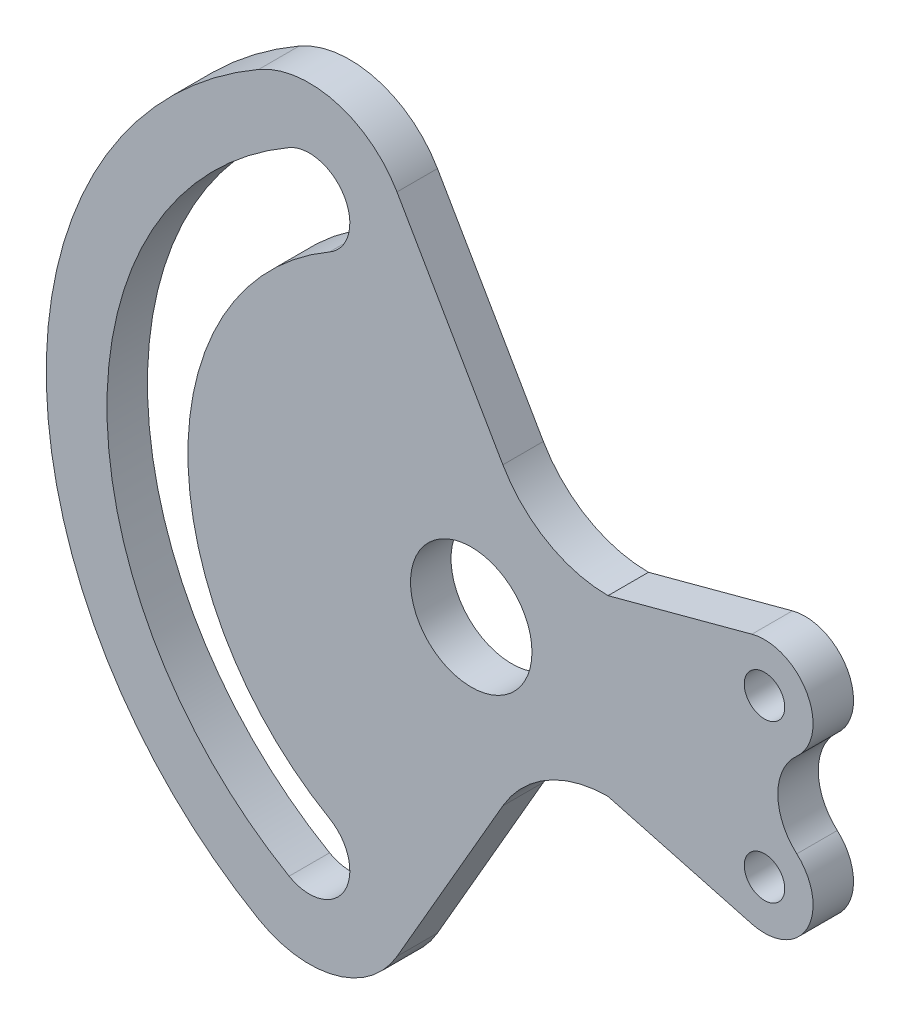
ISO-10303-21;
HEADER;
FILE_DESCRIPTION(('STEP AP214'),'2;1');
FILE_NAME('part.step','',(''),(''),'','','');
FILE_SCHEMA(('AUTOMOTIVE_DESIGN { 1 0 10303 214 1 1 1 1 }'));
ENDSEC;
DATA;
#1=APPLICATION_CONTEXT('core data for automotive mechanical design processes');
#2=APPLICATION_PROTOCOL_DEFINITION('international standard','automotive_design',2000,#1);
#3=PRODUCT_CONTEXT('',#1,'mechanical');
#4=PRODUCT('Part','Part','',(#3));
#5=PRODUCT_RELATED_PRODUCT_CATEGORY('part','',(#4));
#6=PRODUCT_DEFINITION_FORMATION('','',#4);
#7=PRODUCT_DEFINITION_CONTEXT('part definition',#1,'design');
#8=PRODUCT_DEFINITION('design','',#6,#7);
#9=PRODUCT_DEFINITION_SHAPE('','',#8);
#10=(LENGTH_UNIT() NAMED_UNIT(*) SI_UNIT(.MILLI.,.METRE.));
#11=(NAMED_UNIT(*) PLANE_ANGLE_UNIT() SI_UNIT($,.RADIAN.));
#12=(NAMED_UNIT(*) SI_UNIT($,.STERADIAN.) SOLID_ANGLE_UNIT());
#13=UNCERTAINTY_MEASURE_WITH_UNIT(LENGTH_MEASURE(1.E-05),#10,'distance_accuracy_value','');
#14=(GEOMETRIC_REPRESENTATION_CONTEXT(3) GLOBAL_UNCERTAINTY_ASSIGNED_CONTEXT((#13)) GLOBAL_UNIT_ASSIGNED_CONTEXT((#10,
#11,#12)) REPRESENTATION_CONTEXT('',''));
#15=CARTESIAN_POINT('',(0.,0.,0.));
#16=DIRECTION('',(0.,0.,1.));
#17=DIRECTION('',(1.,0.,0.));
#18=AXIS2_PLACEMENT_3D('',#15,#16,#17);
#19=CARTESIAN_POINT('',(-39.9999999999999,-69.2820323027552,10.));
#20=DIRECTION('',(0.,0.,-1.));
#21=DIRECTION('',(-1.,0.,0.));
#22=AXIS2_PLACEMENT_3D('',#19,#20,#21);
#23=PLANE('',#22);
#24=CARTESIAN_POINT('',(72.4444369716801,19.4114283826891,10.));
#25=DIRECTION('',(0.,0.,1.));
#26=DIRECTION('',(1.,0.,0.));
#27=AXIS2_PLACEMENT_3D('',#24,#25,#26);
#28=CIRCLE('',#27,4.99999999999999);
#29=CARTESIAN_POINT('',(77.4444369716801,19.4114283826891,10.));
#30=VERTEX_POINT('',#29);
#31=EDGE_CURVE('E204',#30,#30,#28,.T.);
#32=ORIENTED_EDGE('',*,*,#31,.F.);
#33=EDGE_LOOP('',(#32));
#34=FACE_BOUND('',#33,.T.);
#35=CARTESIAN_POINT('',(-39.9999999999999,-69.2820323027552,10.));
#36=DIRECTION('',(0.,0.,1.));
#37=DIRECTION('',(-1.,0.,0.));
#38=AXIS2_PLACEMENT_3D('',#35,#36,#37);
#39=CIRCLE('',#38,25.);
#40=CARTESIAN_POINT('',(-52.4999999999998,-90.9326673973662,10.));
#41=VERTEX_POINT('',#40);
#42=CARTESIAN_POINT('',(-18.3493649053889,-81.7820323027551,10.));
#43=VERTEX_POINT('',#42);
#44=EDGE_CURVE('E212',#41,#43,#39,.T.);
#45=ORIENTED_EDGE('',*,*,#44,.T.);
#46=DIRECTION('',(0.499999999999999,0.866025403784439,0.));
#47=VECTOR('',#46,1.);
#48=CARTESIAN_POINT('',(7.80758080400635,-36.4768733632617,10.));
#49=LINE('',#48,#47);
#50=CARTESIAN_POINT('',(7.80758080400635,-36.4768733632617,10.));
#51=VERTEX_POINT('',#50);
#52=EDGE_CURVE('E216',#43,#51,#49,.T.);
#53=ORIENTED_EDGE('',*,*,#52,.T.);
#54=CARTESIAN_POINT('',(33.7883429175395,-51.4768733632616,10.));
#55=DIRECTION('',(0.,0.,-1.));
#56=DIRECTION('',(1.,0.,0.));
#57=AXIS2_PLACEMENT_3D('',#54,#55,#56);
#58=CIRCLE('',#57,30.);
#59=CARTESIAN_POINT('',(33.7883429175395,-21.4768733632617,10.));
#60=VERTEX_POINT('',#59);
#61=EDGE_CURVE('E220',#51,#60,#58,.T.);
#62=ORIENTED_EDGE('',*,*,#61,.T.);
#63=DIRECTION('',(0.965925826289068,-0.25881904510252,0.));
#64=VECTOR('',#63,1.);
#65=CARTESIAN_POINT('',(69.3386084304499,-31.0025382981579,10.));
#66=LINE('',#65,#64);
#67=CARTESIAN_POINT('',(69.3386084304499,-31.0025382981579,10.));
#68=VERTEX_POINT('',#67);
#69=EDGE_CURVE('E223',#60,#68,#66,.T.);
#70=ORIENTED_EDGE('',*,*,#69,.T.);
#71=CARTESIAN_POINT('',(72.4444369716801,-19.4114283826891,10.));
#72=DIRECTION('',(0.,0.,1.));
#73=DIRECTION('',(-1.,0.,0.));
#74=AXIS2_PLACEMENT_3D('',#71,#72,#73);
#75=CIRCLE('',#74,12.);
#76=CARTESIAN_POINT('',(80.4278043460509,-10.4523075906788,10.));
#77=VERTEX_POINT('',#76);
#78=EDGE_CURVE('E226',#68,#77,#75,.T.);
#79=ORIENTED_EDGE('',*,*,#78,.T.);
#80=CARTESIAN_POINT('',(89.7417329494834,0.,10.));
#81=DIRECTION('',(0.,0.,-1.));
#82=DIRECTION('',(1.,0.,0.));
#83=AXIS2_PLACEMENT_3D('',#80,#81,#82);
#84=CIRCLE('',#83,14.);
#85=CARTESIAN_POINT('',(80.4278043460509,10.4523075906788,10.));
#86=VERTEX_POINT('',#85);
#87=EDGE_CURVE('E229',#77,#86,#84,.T.);
#88=ORIENTED_EDGE('',*,*,#87,.T.);
#89=CARTESIAN_POINT('',(72.4444369716801,19.4114283826891,10.));
#90=DIRECTION('',(0.,0.,1.));
#91=DIRECTION('',(1.,0.,0.));
#92=AXIS2_PLACEMENT_3D('',#89,#90,#91);
#93=CIRCLE('',#92,12.);
#94=CARTESIAN_POINT('',(69.3386084304499,31.0025382981579,10.));
#95=VERTEX_POINT('',#94);
#96=EDGE_CURVE('E232',#86,#95,#93,.T.);
#97=ORIENTED_EDGE('',*,*,#96,.T.);
#98=DIRECTION('',(-0.965925826289068,-0.25881904510252,0.));
#99=VECTOR('',#98,1.);
#100=CARTESIAN_POINT('',(69.3386084304499,31.0025382981579,10.));
#101=LINE('',#100,#99);
#102=CARTESIAN_POINT('',(33.7883429175395,21.4768733632616,10.));
#103=VERTEX_POINT('',#102);
#104=EDGE_CURVE('E235',#95,#103,#101,.T.);
#105=ORIENTED_EDGE('',*,*,#104,.T.);
#106=CARTESIAN_POINT('',(33.7883429175395,51.4768733632616,10.));
#107=DIRECTION('',(0.,0.,-1.));
#108=DIRECTION('',(-1.,0.,0.));
#109=AXIS2_PLACEMENT_3D('',#106,#107,#108);
#110=CIRCLE('',#109,30.);
#111=CARTESIAN_POINT('',(7.80758080400634,36.4768733632617,10.));
#112=VERTEX_POINT('',#111);
#113=EDGE_CURVE('E238',#103,#112,#110,.T.);
#114=ORIENTED_EDGE('',*,*,#113,.T.);
#115=DIRECTION('',(-0.499999999999999,0.866025403784439,0.));
#116=VECTOR('',#115,1.);
#117=CARTESIAN_POINT('',(7.80758080400635,36.4768733632617,10.));
#118=LINE('',#117,#116);
#119=CARTESIAN_POINT('',(-18.3493649053889,81.7820323027551,10.));
#120=VERTEX_POINT('',#119);
#121=EDGE_CURVE('E241',#112,#120,#118,.T.);
#122=ORIENTED_EDGE('',*,*,#121,.T.);
#123=CARTESIAN_POINT('',(-39.9999999999999,69.2820323027552,10.));
#124=DIRECTION('',(0.,0.,1.));
#125=DIRECTION('',(1.,0.,0.));
#126=AXIS2_PLACEMENT_3D('',#123,#124,#125);
#127=CIRCLE('',#126,25.);
#128=CARTESIAN_POINT('',(-52.4999999999998,90.9326673973662,10.));
#129=VERTEX_POINT('',#128);
#130=EDGE_CURVE('E244',#120,#129,#127,.T.);
#131=ORIENTED_EDGE('',*,*,#130,.T.);
#132=CARTESIAN_POINT('',(0.,0.,10.));
#133=DIRECTION('',(0.,0.,1.));
#134=DIRECTION('',(1.,0.,0.));
#135=AXIS2_PLACEMENT_3D('',#132,#133,#134);
#136=CIRCLE('',#135,105.);
#137=EDGE_CURVE('E247',#129,#41,#136,.T.);
#138=ORIENTED_EDGE('',*,*,#137,.T.);
#139=EDGE_LOOP('',(#45,#53,#62,#70,#79,#88,#97,#105,#114,#122,#131,#138));
#140=FACE_BOUND('',#139,.T.);
#141=CARTESIAN_POINT('',(-39.9999999999999,69.2820323027552,10.));
#142=DIRECTION('',(0.,0.,1.));
#143=DIRECTION('',(1.,0.,0.));
#144=AXIS2_PLACEMENT_3D('',#141,#142,#143);
#145=CIRCLE('',#144,10.);
#146=CARTESIAN_POINT('',(-35.,60.6217782649107,10.));
#147=VERTEX_POINT('',#146);
#148=CARTESIAN_POINT('',(-45.,77.9422863405995,10.));
#149=VERTEX_POINT('',#148);
#150=EDGE_CURVE('E153',#147,#149,#145,.T.);
#151=ORIENTED_EDGE('',*,*,#150,.F.);
#152=CARTESIAN_POINT('',(0.,0.,10.));
#153=DIRECTION('',(0.,0.,-1.));
#154=DIRECTION('',(1.,0.,0.));
#155=AXIS2_PLACEMENT_3D('',#152,#153,#154);
#156=CIRCLE('',#155,70.);
#157=CARTESIAN_POINT('',(-35.,-60.6217782649107,10.));
#158=VERTEX_POINT('',#157);
#159=EDGE_CURVE('E180',#158,#147,#156,.T.);
#160=ORIENTED_EDGE('',*,*,#159,.F.);
#161=CARTESIAN_POINT('',(-40.,-69.2820323027551,10.));
#162=DIRECTION('',(0.,0.,1.));
#163=DIRECTION('',(1.,0.,0.));
#164=AXIS2_PLACEMENT_3D('',#161,#162,#163);
#165=CIRCLE('',#164,10.);
#166=CARTESIAN_POINT('',(-45.,-77.9422863405995,10.));
#167=VERTEX_POINT('',#166);
#168=EDGE_CURVE('E176',#167,#158,#165,.T.);
#169=ORIENTED_EDGE('',*,*,#168,.F.);
#170=CARTESIAN_POINT('',(0.,0.,10.));
#171=DIRECTION('',(0.,0.,1.));
#172=DIRECTION('',(1.,0.,0.));
#173=AXIS2_PLACEMENT_3D('',#170,#171,#172);
#174=CIRCLE('',#173,90.);
#175=EDGE_CURVE('E162',#149,#167,#174,.T.);
#176=ORIENTED_EDGE('',*,*,#175,.F.);
#177=EDGE_LOOP('',(#151,#160,#169,#176));
#178=FACE_BOUND('',#177,.T.);
#179=CARTESIAN_POINT('',(0.,0.,10.));
#180=DIRECTION('',(0.,0.,1.));
#181=DIRECTION('',(1.,0.,0.));
#182=AXIS2_PLACEMENT_3D('',#179,#180,#181);
#183=CIRCLE('',#182,15.);
#184=CARTESIAN_POINT('',(15.,0.,10.));
#185=VERTEX_POINT('',#184);
#186=EDGE_CURVE('E188',#185,#185,#183,.T.);
#187=ORIENTED_EDGE('',*,*,#186,.F.);
#188=EDGE_LOOP('',(#187));
#189=FACE_BOUND('',#188,.T.);
#190=CARTESIAN_POINT('',(72.4444369716801,-19.4114283826891,10.));
#191=DIRECTION('',(0.,0.,1.));
#192=DIRECTION('',(-1.,0.,0.));
#193=AXIS2_PLACEMENT_3D('',#190,#191,#192);
#194=CIRCLE('',#193,4.99999999999999);
#195=CARTESIAN_POINT('',(67.4444369716801,-19.4114283826891,10.));
#196=VERTEX_POINT('',#195);
#197=EDGE_CURVE('E568',#196,#196,#194,.T.);
#198=ORIENTED_EDGE('',*,*,#197,.F.);
#199=EDGE_LOOP('',(#198));
#200=FACE_BOUND('',#199,.T.);
#201=ADVANCED_FACE('F39',(#34,#140,#178,#189,#200),#23,.F.);
#202=CARTESIAN_POINT('',(-39.9999999999999,-69.2820323027552,0.));
#203=DIRECTION('',(0.,0.,-1.));
#204=DIRECTION('',(-1.,0.,0.));
#205=AXIS2_PLACEMENT_3D('',#202,#203,#204);
#206=PLANE('',#205);
#207=CARTESIAN_POINT('',(0.,0.,0.));
#208=DIRECTION('',(0.,0.,1.));
#209=DIRECTION('',(1.,0.,0.));
#210=AXIS2_PLACEMENT_3D('',#207,#208,#209);
#211=CIRCLE('',#210,15.);
#212=CARTESIAN_POINT('',(15.,0.,0.));
#213=VERTEX_POINT('',#212);
#214=EDGE_CURVE('E576',#213,#213,#211,.T.);
#215=ORIENTED_EDGE('',*,*,#214,.T.);
#216=EDGE_LOOP('',(#215));
#217=FACE_BOUND('',#216,.T.);
#218=CARTESIAN_POINT('',(-39.9999999999999,-69.2820323027552,0.));
#219=DIRECTION('',(0.,0.,1.));
#220=DIRECTION('',(-1.,0.,0.));
#221=AXIS2_PLACEMENT_3D('',#218,#219,#220);
#222=CIRCLE('',#221,25.);
#223=CARTESIAN_POINT('',(-52.4999999999998,-90.9326673973662,0.));
#224=VERTEX_POINT('',#223);
#225=CARTESIAN_POINT('',(-18.3493649053889,-81.7820323027551,0.));
#226=VERTEX_POINT('',#225);
#227=EDGE_CURVE('E208',#224,#226,#222,.T.);
#228=ORIENTED_EDGE('',*,*,#227,.F.);
#229=CARTESIAN_POINT('',(0.,0.,0.));
#230=DIRECTION('',(0.,0.,1.));
#231=DIRECTION('',(1.,0.,0.));
#232=AXIS2_PLACEMENT_3D('',#229,#230,#231);
#233=CIRCLE('',#232,105.);
#234=CARTESIAN_POINT('',(-52.4999999999998,90.9326673973662,0.));
#235=VERTEX_POINT('',#234);
#236=EDGE_CURVE('E217',#235,#224,#233,.T.);
#237=ORIENTED_EDGE('',*,*,#236,.F.);
#238=CARTESIAN_POINT('',(-39.9999999999999,69.2820323027552,0.));
#239=DIRECTION('',(0.,0.,1.));
#240=DIRECTION('',(1.,0.,0.));
#241=AXIS2_PLACEMENT_3D('',#238,#239,#240);
#242=CIRCLE('',#241,25.);
#243=CARTESIAN_POINT('',(-18.3493649053889,81.7820323027551,0.));
#244=VERTEX_POINT('',#243);
#245=EDGE_CURVE('E281',#244,#235,#242,.T.);
#246=ORIENTED_EDGE('',*,*,#245,.F.);
#247=DIRECTION('',(-0.499999999999999,0.866025403784439,0.));
#248=VECTOR('',#247,1.);
#249=CARTESIAN_POINT('',(7.80758080400635,36.4768733632617,0.));
#250=LINE('',#249,#248);
#251=CARTESIAN_POINT('',(7.80758080400634,36.4768733632617,0.));
#252=VERTEX_POINT('',#251);
#253=EDGE_CURVE('E278',#252,#244,#250,.T.);
#254=ORIENTED_EDGE('',*,*,#253,.F.);
#255=CARTESIAN_POINT('',(33.7883429175395,51.4768733632616,0.));
#256=DIRECTION('',(0.,0.,-1.));
#257=DIRECTION('',(-1.,0.,0.));
#258=AXIS2_PLACEMENT_3D('',#255,#256,#257);
#259=CIRCLE('',#258,30.);
#260=CARTESIAN_POINT('',(33.7883429175395,21.4768733632616,0.));
#261=VERTEX_POINT('',#260);
#262=EDGE_CURVE('E275',#261,#252,#259,.T.);
#263=ORIENTED_EDGE('',*,*,#262,.F.);
#264=DIRECTION('',(-0.965925826289068,-0.25881904510252,0.));
#265=VECTOR('',#264,1.);
#266=CARTESIAN_POINT('',(69.3386084304499,31.0025382981579,0.));
#267=LINE('',#266,#265);
#268=CARTESIAN_POINT('',(69.3386084304499,31.0025382981579,0.));
#269=VERTEX_POINT('',#268);
#270=EDGE_CURVE('E272',#269,#261,#267,.T.);
#271=ORIENTED_EDGE('',*,*,#270,.F.);
#272=CARTESIAN_POINT('',(72.4444369716801,19.4114283826891,0.));
#273=DIRECTION('',(0.,0.,1.));
#274=DIRECTION('',(1.,0.,0.));
#275=AXIS2_PLACEMENT_3D('',#272,#273,#274);
#276=CIRCLE('',#275,12.);
#277=CARTESIAN_POINT('',(80.4278043460509,10.4523075906788,0.));
#278=VERTEX_POINT('',#277);
#279=EDGE_CURVE('E269',#278,#269,#276,.T.);
#280=ORIENTED_EDGE('',*,*,#279,.F.);
#281=CARTESIAN_POINT('',(89.7417329494834,0.,0.));
#282=DIRECTION('',(0.,0.,-1.));
#283=DIRECTION('',(1.,0.,0.));
#284=AXIS2_PLACEMENT_3D('',#281,#282,#283);
#285=CIRCLE('',#284,14.);
#286=CARTESIAN_POINT('',(80.4278043460509,-10.4523075906788,0.));
#287=VERTEX_POINT('',#286);
#288=EDGE_CURVE('E266',#287,#278,#285,.T.);
#289=ORIENTED_EDGE('',*,*,#288,.F.);
#290=CARTESIAN_POINT('',(72.4444369716801,-19.4114283826891,0.));
#291=DIRECTION('',(0.,0.,1.));
#292=DIRECTION('',(-1.,0.,0.));
#293=AXIS2_PLACEMENT_3D('',#290,#291,#292);
#294=CIRCLE('',#293,12.);
#295=CARTESIAN_POINT('',(69.3386084304499,-31.0025382981579,0.));
#296=VERTEX_POINT('',#295);
#297=EDGE_CURVE('E263',#296,#287,#294,.T.);
#298=ORIENTED_EDGE('',*,*,#297,.F.);
#299=DIRECTION('',(0.965925826289068,-0.25881904510252,0.));
#300=VECTOR('',#299,1.);
#301=CARTESIAN_POINT('',(69.3386084304499,-31.0025382981579,0.));
#302=LINE('',#301,#300);
#303=CARTESIAN_POINT('',(33.7883429175395,-21.4768733632617,0.));
#304=VERTEX_POINT('',#303);
#305=EDGE_CURVE('E260',#304,#296,#302,.T.);
#306=ORIENTED_EDGE('',*,*,#305,.F.);
#307=CARTESIAN_POINT('',(33.7883429175395,-51.4768733632616,0.));
#308=DIRECTION('',(0.,0.,-1.));
#309=DIRECTION('',(1.,0.,0.));
#310=AXIS2_PLACEMENT_3D('',#307,#308,#309);
#311=CIRCLE('',#310,30.);
#312=CARTESIAN_POINT('',(7.80758080400635,-36.4768733632617,0.));
#313=VERTEX_POINT('',#312);
#314=EDGE_CURVE('E257',#313,#304,#311,.T.);
#315=ORIENTED_EDGE('',*,*,#314,.F.);
#316=DIRECTION('',(0.499999999999999,0.866025403784439,0.));
#317=VECTOR('',#316,1.);
#318=CARTESIAN_POINT('',(7.80758080400635,-36.4768733632617,0.));
#319=LINE('',#318,#317);
#320=EDGE_CURVE('E254',#226,#313,#319,.T.);
#321=ORIENTED_EDGE('',*,*,#320,.F.);
#322=EDGE_LOOP('',(#228,#237,#246,#254,#263,#271,#280,#289,#298,#306,#315,#321));
#323=FACE_BOUND('',#322,.T.);
#324=CARTESIAN_POINT('',(72.4444369716801,19.4114283826891,0.));
#325=DIRECTION('',(0.,0.,1.));
#326=DIRECTION('',(1.,0.,0.));
#327=AXIS2_PLACEMENT_3D('',#324,#325,#326);
#328=CIRCLE('',#327,4.99999999999999);
#329=CARTESIAN_POINT('',(77.4444369716801,19.4114283826891,0.));
#330=VERTEX_POINT('',#329);
#331=EDGE_CURVE('E171',#330,#330,#328,.T.);
#332=ORIENTED_EDGE('',*,*,#331,.T.);
#333=EDGE_LOOP('',(#332));
#334=FACE_BOUND('',#333,.T.);
#335=CARTESIAN_POINT('',(0.,0.,0.));
#336=DIRECTION('',(0.,0.,-1.));
#337=DIRECTION('',(1.,0.,0.));
#338=AXIS2_PLACEMENT_3D('',#335,#336,#337);
#339=CIRCLE('',#338,70.);
#340=CARTESIAN_POINT('',(-35.,-60.6217782649107,0.));
#341=VERTEX_POINT('',#340);
#342=CARTESIAN_POINT('',(-35.,60.6217782649107,0.));
#343=VERTEX_POINT('',#342);
#344=EDGE_CURVE('E163',#341,#343,#339,.T.);
#345=ORIENTED_EDGE('',*,*,#344,.T.);
#346=CARTESIAN_POINT('',(-39.9999999999999,69.2820323027552,0.));
#347=DIRECTION('',(0.,0.,1.));
#348=DIRECTION('',(1.,0.,0.));
#349=AXIS2_PLACEMENT_3D('',#346,#347,#348);
#350=CIRCLE('',#349,10.);
#351=CARTESIAN_POINT('',(-45.,77.9422863405995,0.));
#352=VERTEX_POINT('',#351);
#353=EDGE_CURVE('E63',#343,#352,#350,.T.);
#354=ORIENTED_EDGE('',*,*,#353,.T.);
#355=CARTESIAN_POINT('',(0.,0.,0.));
#356=DIRECTION('',(0.,0.,1.));
#357=DIRECTION('',(1.,0.,0.));
#358=AXIS2_PLACEMENT_3D('',#355,#356,#357);
#359=CIRCLE('',#358,90.);
#360=CARTESIAN_POINT('',(-45.,-77.9422863405995,0.));
#361=VERTEX_POINT('',#360);
#362=EDGE_CURVE('E169',#352,#361,#359,.T.);
#363=ORIENTED_EDGE('',*,*,#362,.T.);
#364=CARTESIAN_POINT('',(-40.,-69.2820323027551,0.));
#365=DIRECTION('',(0.,0.,1.));
#366=DIRECTION('',(1.,0.,0.));
#367=AXIS2_PLACEMENT_3D('',#364,#365,#366);
#368=CIRCLE('',#367,10.);
#369=EDGE_CURVE('E191',#361,#341,#368,.T.);
#370=ORIENTED_EDGE('',*,*,#369,.T.);
#371=EDGE_LOOP('',(#345,#354,#363,#370));
#372=FACE_BOUND('',#371,.T.);
#373=CARTESIAN_POINT('',(72.4444369716801,-19.4114283826891,0.));
#374=DIRECTION('',(0.,0.,1.));
#375=DIRECTION('',(-1.,0.,0.));
#376=AXIS2_PLACEMENT_3D('',#373,#374,#375);
#377=CIRCLE('',#376,4.99999999999999);
#378=CARTESIAN_POINT('',(67.4444369716801,-19.4114283826891,0.));
#379=VERTEX_POINT('',#378);
#380=EDGE_CURVE('E571',#379,#379,#377,.T.);
#381=ORIENTED_EDGE('',*,*,#380,.T.);
#382=EDGE_LOOP('',(#381));
#383=FACE_BOUND('',#382,.T.);
#384=ADVANCED_FACE('F336',(#217,#323,#334,#372,#383),#206,.T.);
#385=CARTESIAN_POINT('',(-39.9999999999999,-69.2820323027552,10.));
#386=DIRECTION('',(0.,0.,-1.));
#387=DIRECTION('',(-1.,0.,0.));
#388=AXIS2_PLACEMENT_3D('',#385,#386,#387);
#389=CYLINDRICAL_SURFACE('',#388,25.);
#390=ORIENTED_EDGE('',*,*,#227,.T.);
#391=DIRECTION('',(0.,0.,-1.));
#392=VECTOR('',#391,1.);
#393=CARTESIAN_POINT('',(-18.3493649053889,-81.7820323027551,10.));
#394=LINE('',#393,#392);
#395=EDGE_CURVE('E11',#43,#226,#394,.T.);
#396=ORIENTED_EDGE('',*,*,#395,.F.);
#397=ORIENTED_EDGE('',*,*,#44,.F.);
#398=DIRECTION('',(0.,0.,-1.));
#399=VECTOR('',#398,1.);
#400=CARTESIAN_POINT('',(-52.4999999999998,-90.9326673973662,10.));
#401=LINE('',#400,#399);
#402=EDGE_CURVE('E250',#41,#224,#401,.T.);
#403=ORIENTED_EDGE('',*,*,#402,.T.);
#404=EDGE_LOOP('',(#390,#396,#397,#403));
#405=FACE_BOUND('',#404,.T.);
#406=ADVANCED_FACE('F41',(#405),#389,.T.);
#407=CARTESIAN_POINT('',(7.80758080400635,-36.4768733632617,10.));
#408=DIRECTION('',(-0.866025403784439,0.499999999999999,0.));
#409=DIRECTION('',(-0.499999999999999,-0.866025403784439,0.));
#410=AXIS2_PLACEMENT_3D('',#407,#408,#409);
#411=PLANE('',#410);
#412=ORIENTED_EDGE('',*,*,#320,.T.);
#413=DIRECTION('',(0.,0.,-1.));
#414=VECTOR('',#413,1.);
#415=CARTESIAN_POINT('',(7.80758080400635,-36.4768733632617,10.));
#416=LINE('',#415,#414);
#417=EDGE_CURVE('E48',#51,#313,#416,.T.);
#418=ORIENTED_EDGE('',*,*,#417,.F.);
#419=ORIENTED_EDGE('',*,*,#52,.F.);
#420=ORIENTED_EDGE('',*,*,#395,.T.);
#421=EDGE_LOOP('',(#412,#418,#419,#420));
#422=FACE_BOUND('',#421,.T.);
#423=ADVANCED_FACE('F353',(#422),#411,.F.);
#424=CARTESIAN_POINT('',(33.7883429175395,-51.4768733632616,10.));
#425=DIRECTION('',(0.,0.,-1.));
#426=DIRECTION('',(-1.,0.,0.));
#427=AXIS2_PLACEMENT_3D('',#424,#425,#426);
#428=CYLINDRICAL_SURFACE('',#427,30.);
#429=ORIENTED_EDGE('',*,*,#314,.T.);
#430=DIRECTION('',(0.,0.,-1.));
#431=VECTOR('',#430,1.);
#432=CARTESIAN_POINT('',(33.7883429175395,-21.4768733632617,10.));
#433=LINE('',#432,#431);
#434=EDGE_CURVE('E321',#60,#304,#433,.T.);
#435=ORIENTED_EDGE('',*,*,#434,.F.);
#436=ORIENTED_EDGE('',*,*,#61,.F.);
#437=ORIENTED_EDGE('',*,*,#417,.T.);
#438=EDGE_LOOP('',(#429,#435,#436,#437));
#439=FACE_BOUND('',#438,.T.);
#440=ADVANCED_FACE('F330',(#439),#428,.F.);
#441=CARTESIAN_POINT('',(69.3386084304499,-31.0025382981579,10.));
#442=DIRECTION('',(0.25881904510252,0.965925826289068,0.));
#443=DIRECTION('',(-0.965925826289068,0.25881904510252,0.));
#444=AXIS2_PLACEMENT_3D('',#441,#442,#443);
#445=PLANE('',#444);
#446=ORIENTED_EDGE('',*,*,#305,.T.);
#447=DIRECTION('',(0.,0.,-1.));
#448=VECTOR('',#447,1.);
#449=CARTESIAN_POINT('',(69.3386084304499,-31.0025382981579,10.));
#450=LINE('',#449,#448);
#451=EDGE_CURVE('E317',#68,#296,#450,.T.);
#452=ORIENTED_EDGE('',*,*,#451,.F.);
#453=ORIENTED_EDGE('',*,*,#69,.F.);
#454=ORIENTED_EDGE('',*,*,#434,.T.);
#455=EDGE_LOOP('',(#446,#452,#453,#454));
#456=FACE_BOUND('',#455,.T.);
#457=ADVANCED_FACE('F342',(#456),#445,.F.);
#458=CARTESIAN_POINT('',(72.4444369716801,-19.4114283826891,10.));
#459=DIRECTION('',(0.,0.,-1.));
#460=DIRECTION('',(-1.,0.,0.));
#461=AXIS2_PLACEMENT_3D('',#458,#459,#460);
#462=CYLINDRICAL_SURFACE('',#461,12.);
#463=ORIENTED_EDGE('',*,*,#297,.T.);
#464=DIRECTION('',(0.,0.,-1.));
#465=VECTOR('',#464,1.);
#466=CARTESIAN_POINT('',(80.4278043460509,-10.4523075906788,10.));
#467=LINE('',#466,#465);
#468=EDGE_CURVE('E313',#77,#287,#467,.T.);
#469=ORIENTED_EDGE('',*,*,#468,.F.);
#470=ORIENTED_EDGE('',*,*,#78,.F.);
#471=ORIENTED_EDGE('',*,*,#451,.T.);
#472=EDGE_LOOP('',(#463,#469,#470,#471));
#473=FACE_BOUND('',#472,.T.);
#474=ADVANCED_FACE('F346',(#473),#462,.T.);
#475=CARTESIAN_POINT('',(89.7417329494834,0.,10.));
#476=DIRECTION('',(0.,0.,-1.));
#477=DIRECTION('',(-1.,0.,0.));
#478=AXIS2_PLACEMENT_3D('',#475,#476,#477);
#479=CYLINDRICAL_SURFACE('',#478,14.);
#480=ORIENTED_EDGE('',*,*,#288,.T.);
#481=DIRECTION('',(0.,0.,-1.));
#482=VECTOR('',#481,1.);
#483=CARTESIAN_POINT('',(80.4278043460509,10.4523075906788,10.));
#484=LINE('',#483,#482);
#485=EDGE_CURVE('E309',#86,#278,#484,.T.);
#486=ORIENTED_EDGE('',*,*,#485,.F.);
#487=ORIENTED_EDGE('',*,*,#87,.F.);
#488=ORIENTED_EDGE('',*,*,#468,.T.);
#489=EDGE_LOOP('',(#480,#486,#487,#488));
#490=FACE_BOUND('',#489,.T.);
#491=ADVANCED_FACE('F386',(#490),#479,.F.);
#492=CARTESIAN_POINT('',(72.4444369716801,19.4114283826891,10.));
#493=DIRECTION('',(0.,0.,-1.));
#494=DIRECTION('',(-1.,0.,0.));
#495=AXIS2_PLACEMENT_3D('',#492,#493,#494);
#496=CYLINDRICAL_SURFACE('',#495,12.);
#497=ORIENTED_EDGE('',*,*,#279,.T.);
#498=DIRECTION('',(0.,0.,-1.));
#499=VECTOR('',#498,1.);
#500=CARTESIAN_POINT('',(69.3386084304499,31.0025382981579,10.));
#501=LINE('',#500,#499);
#502=EDGE_CURVE('E305',#95,#269,#501,.T.);
#503=ORIENTED_EDGE('',*,*,#502,.F.);
#504=ORIENTED_EDGE('',*,*,#96,.F.);
#505=ORIENTED_EDGE('',*,*,#485,.T.);
#506=EDGE_LOOP('',(#497,#503,#504,#505));
#507=FACE_BOUND('',#506,.T.);
#508=ADVANCED_FACE('F384',(#507),#496,.T.);
#509=CARTESIAN_POINT('',(69.3386084304499,31.0025382981579,10.));
#510=DIRECTION('',(0.25881904510252,-0.965925826289068,0.));
#511=DIRECTION('',(0.965925826289068,0.25881904510252,0.));
#512=AXIS2_PLACEMENT_3D('',#509,#510,#511);
#513=PLANE('',#512);
#514=ORIENTED_EDGE('',*,*,#270,.T.);
#515=DIRECTION('',(0.,0.,-1.));
#516=VECTOR('',#515,1.);
#517=CARTESIAN_POINT('',(33.7883429175395,21.4768733632616,10.));
#518=LINE('',#517,#516);
#519=EDGE_CURVE('E301',#103,#261,#518,.T.);
#520=ORIENTED_EDGE('',*,*,#519,.F.);
#521=ORIENTED_EDGE('',*,*,#104,.F.);
#522=ORIENTED_EDGE('',*,*,#502,.T.);
#523=EDGE_LOOP('',(#514,#520,#521,#522));
#524=FACE_BOUND('',#523,.T.);
#525=ADVANCED_FACE('F380',(#524),#513,.F.);
#526=CARTESIAN_POINT('',(33.7883429175395,51.4768733632616,10.));
#527=DIRECTION('',(0.,0.,-1.));
#528=DIRECTION('',(-1.,0.,0.));
#529=AXIS2_PLACEMENT_3D('',#526,#527,#528);
#530=CYLINDRICAL_SURFACE('',#529,30.);
#531=ORIENTED_EDGE('',*,*,#262,.T.);
#532=DIRECTION('',(0.,0.,-1.));
#533=VECTOR('',#532,1.);
#534=CARTESIAN_POINT('',(7.80758080400634,36.4768733632617,10.));
#535=LINE('',#534,#533);
#536=EDGE_CURVE('E297',#112,#252,#535,.T.);
#537=ORIENTED_EDGE('',*,*,#536,.F.);
#538=ORIENTED_EDGE('',*,*,#113,.F.);
#539=ORIENTED_EDGE('',*,*,#519,.T.);
#540=EDGE_LOOP('',(#531,#537,#538,#539));
#541=FACE_BOUND('',#540,.T.);
#542=ADVANCED_FACE('F375',(#541),#530,.F.);
#543=CARTESIAN_POINT('',(7.80758080400635,36.4768733632617,10.));
#544=DIRECTION('',(-0.866025403784439,-0.499999999999999,0.));
#545=DIRECTION('',(0.499999999999999,-0.866025403784439,0.));
#546=AXIS2_PLACEMENT_3D('',#543,#544,#545);
#547=PLANE('',#546);
#548=ORIENTED_EDGE('',*,*,#253,.T.);
#549=DIRECTION('',(0.,0.,-1.));
#550=VECTOR('',#549,1.);
#551=CARTESIAN_POINT('',(-18.3493649053889,81.7820323027551,10.));
#552=LINE('',#551,#550);
#553=EDGE_CURVE('E293',#120,#244,#552,.T.);
#554=ORIENTED_EDGE('',*,*,#553,.F.);
#555=ORIENTED_EDGE('',*,*,#121,.F.);
#556=ORIENTED_EDGE('',*,*,#536,.T.);
#557=EDGE_LOOP('',(#548,#554,#555,#556));
#558=FACE_BOUND('',#557,.T.);
#559=ADVANCED_FACE('F369',(#558),#547,.F.);
#560=CARTESIAN_POINT('',(-39.9999999999999,69.2820323027552,10.));
#561=DIRECTION('',(0.,0.,-1.));
#562=DIRECTION('',(-1.,0.,0.));
#563=AXIS2_PLACEMENT_3D('',#560,#561,#562);
#564=CYLINDRICAL_SURFACE('',#563,25.);
#565=ORIENTED_EDGE('',*,*,#245,.T.);
#566=DIRECTION('',(0.,0.,-1.));
#567=VECTOR('',#566,1.);
#568=CARTESIAN_POINT('',(-52.4999999999998,90.9326673973662,10.));
#569=LINE('',#568,#567);
#570=EDGE_CURVE('E289',#129,#235,#569,.T.);
#571=ORIENTED_EDGE('',*,*,#570,.F.);
#572=ORIENTED_EDGE('',*,*,#130,.F.);
#573=ORIENTED_EDGE('',*,*,#553,.T.);
#574=EDGE_LOOP('',(#565,#571,#572,#573));
#575=FACE_BOUND('',#574,.T.);
#576=ADVANCED_FACE('F365',(#575),#564,.T.);
#577=CARTESIAN_POINT('',(0.,0.,10.));
#578=DIRECTION('',(0.,0.,-1.));
#579=DIRECTION('',(-1.,0.,0.));
#580=AXIS2_PLACEMENT_3D('',#577,#578,#579);
#581=CYLINDRICAL_SURFACE('',#580,105.);
#582=ORIENTED_EDGE('',*,*,#236,.T.);
#583=ORIENTED_EDGE('',*,*,#402,.F.);
#584=ORIENTED_EDGE('',*,*,#137,.F.);
#585=ORIENTED_EDGE('',*,*,#570,.T.);
#586=EDGE_LOOP('',(#582,#583,#584,#585));
#587=FACE_BOUND('',#586,.T.);
#588=ADVANCED_FACE('F360',(#587),#581,.T.);
#589=CARTESIAN_POINT('',(72.4444369716801,19.4114283826891,10.));
#590=DIRECTION('',(0.,0.,-1.));
#591=DIRECTION('',(-1.,0.,0.));
#592=AXIS2_PLACEMENT_3D('',#589,#590,#591);
#593=CYLINDRICAL_SURFACE('',#592,4.99999999999999);
#594=ORIENTED_EDGE('',*,*,#31,.T.);
#595=EDGE_LOOP('',(#594));
#596=FACE_BOUND('',#595,.T.);
#597=ORIENTED_EDGE('',*,*,#331,.F.);
#598=EDGE_LOOP('',(#597));
#599=FACE_BOUND('',#598,.T.);
#600=ADVANCED_FACE('F405',(#596,#599),#593,.F.);
#601=CARTESIAN_POINT('',(-39.9999999999999,69.2820323027552,10.));
#602=DIRECTION('',(0.,0.,-1.));
#603=DIRECTION('',(-1.,0.,0.));
#604=AXIS2_PLACEMENT_3D('',#601,#602,#603);
#605=CYLINDRICAL_SURFACE('',#604,10.);
#606=ORIENTED_EDGE('',*,*,#353,.F.);
#607=DIRECTION('',(0.,0.,-1.));
#608=VECTOR('',#607,1.);
#609=CARTESIAN_POINT('',(-35.,60.6217782649107,10.));
#610=LINE('',#609,#608);
#611=EDGE_CURVE('E157',#147,#343,#610,.T.);
#612=ORIENTED_EDGE('',*,*,#611,.F.);
#613=ORIENTED_EDGE('',*,*,#150,.T.);
#614=DIRECTION('',(0.,0.,-1.));
#615=VECTOR('',#614,1.);
#616=CARTESIAN_POINT('',(-45.,77.9422863405995,10.));
#617=LINE('',#616,#615);
#618=EDGE_CURVE('E156',#149,#352,#617,.T.);
#619=ORIENTED_EDGE('',*,*,#618,.T.);
#620=EDGE_LOOP('',(#606,#612,#613,#619));
#621=FACE_BOUND('',#620,.T.);
#622=ADVANCED_FACE('F155',(#621),#605,.F.);
#623=CARTESIAN_POINT('',(0.,0.,10.));
#624=DIRECTION('',(0.,0.,-1.));
#625=DIRECTION('',(-1.,0.,0.));
#626=AXIS2_PLACEMENT_3D('',#623,#624,#625);
#627=CYLINDRICAL_SURFACE('',#626,90.);
#628=ORIENTED_EDGE('',*,*,#362,.F.);
#629=ORIENTED_EDGE('',*,*,#618,.F.);
#630=ORIENTED_EDGE('',*,*,#175,.T.);
#631=DIRECTION('',(0.,0.,-1.));
#632=VECTOR('',#631,1.);
#633=CARTESIAN_POINT('',(-45.,-77.9422863405995,10.));
#634=LINE('',#633,#632);
#635=EDGE_CURVE('E172',#167,#361,#634,.T.);
#636=ORIENTED_EDGE('',*,*,#635,.T.);
#637=EDGE_LOOP('',(#628,#629,#630,#636));
#638=FACE_BOUND('',#637,.T.);
#639=ADVANCED_FACE('F166',(#638),#627,.F.);
#640=CARTESIAN_POINT('',(-40.,-69.2820323027551,10.));
#641=DIRECTION('',(0.,0.,-1.));
#642=DIRECTION('',(-1.,0.,0.));
#643=AXIS2_PLACEMENT_3D('',#640,#641,#642);
#644=CYLINDRICAL_SURFACE('',#643,10.);
#645=ORIENTED_EDGE('',*,*,#369,.F.);
#646=ORIENTED_EDGE('',*,*,#635,.F.);
#647=ORIENTED_EDGE('',*,*,#168,.T.);
#648=DIRECTION('',(0.,0.,-1.));
#649=VECTOR('',#648,1.);
#650=CARTESIAN_POINT('',(-35.,-60.6217782649107,10.));
#651=LINE('',#650,#649);
#652=EDGE_CURVE('E55',#158,#341,#651,.T.);
#653=ORIENTED_EDGE('',*,*,#652,.T.);
#654=EDGE_LOOP('',(#645,#646,#647,#653));
#655=FACE_BOUND('',#654,.T.);
#656=ADVANCED_FACE('F454',(#655),#644,.F.);
#657=CARTESIAN_POINT('',(0.,0.,10.));
#658=DIRECTION('',(0.,0.,-1.));
#659=DIRECTION('',(-1.,0.,0.));
#660=AXIS2_PLACEMENT_3D('',#657,#658,#659);
#661=CYLINDRICAL_SURFACE('',#660,70.);
#662=ORIENTED_EDGE('',*,*,#344,.F.);
#663=ORIENTED_EDGE('',*,*,#652,.F.);
#664=ORIENTED_EDGE('',*,*,#159,.T.);
#665=ORIENTED_EDGE('',*,*,#611,.T.);
#666=EDGE_LOOP('',(#662,#663,#664,#665));
#667=FACE_BOUND('',#666,.T.);
#668=ADVANCED_FACE('F461',(#667),#661,.T.);
#669=CARTESIAN_POINT('',(0.,0.,10.));
#670=DIRECTION('',(0.,0.,-1.));
#671=DIRECTION('',(-1.,0.,0.));
#672=AXIS2_PLACEMENT_3D('',#669,#670,#671);
#673=CYLINDRICAL_SURFACE('',#672,15.);
#674=ORIENTED_EDGE('',*,*,#186,.T.);
#675=EDGE_LOOP('',(#674));
#676=FACE_BOUND('',#675,.T.);
#677=ORIENTED_EDGE('',*,*,#214,.F.);
#678=EDGE_LOOP('',(#677));
#679=FACE_BOUND('',#678,.T.);
#680=ADVANCED_FACE('F469',(#676,#679),#673,.F.);
#681=CARTESIAN_POINT('',(72.4444369716801,-19.4114283826891,10.));
#682=DIRECTION('',(0.,0.,-1.));
#683=DIRECTION('',(-1.,0.,0.));
#684=AXIS2_PLACEMENT_3D('',#681,#682,#683);
#685=CYLINDRICAL_SURFACE('',#684,4.99999999999999);
#686=ORIENTED_EDGE('',*,*,#197,.T.);
#687=EDGE_LOOP('',(#686));
#688=FACE_BOUND('',#687,.T.);
#689=ORIENTED_EDGE('',*,*,#380,.F.);
#690=EDGE_LOOP('',(#689));
#691=FACE_BOUND('',#690,.T.);
#692=ADVANCED_FACE('F476',(#688,#691),#685,.F.);
#693=CLOSED_SHELL('',(#201,#384,#406,#423,#440,#457,#474,#491,#508,#525,#542,#559,#576,#588,
#600,#622,#639,#656,#668,#680,#692));
#694=MANIFOLD_SOLID_BREP('B2',#693);
#695=ADVANCED_BREP_SHAPE_REPRESENTATION('',(#18,#694),#14);
#696=SHAPE_DEFINITION_REPRESENTATION(#9,#695);
ENDSEC;
END-ISO-10303-21;
